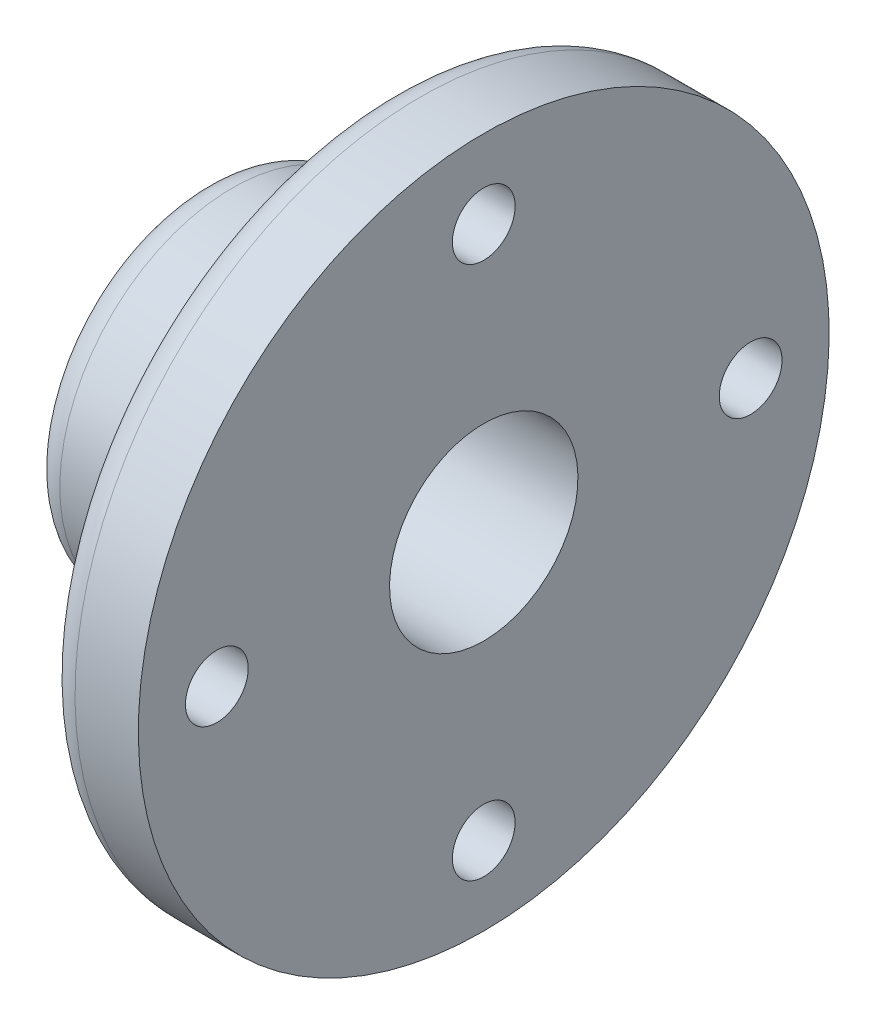
ISO-10303-21;
HEADER;
FILE_DESCRIPTION(('STEP AP214'),'2;1');
FILE_NAME('part.step','',(''),(''),'','','');
FILE_SCHEMA(('AUTOMOTIVE_DESIGN { 1 0 10303 214 1 1 1 1 }'));
ENDSEC;
DATA;
#1=APPLICATION_CONTEXT('core data for automotive mechanical design processes');
#2=APPLICATION_PROTOCOL_DEFINITION('international standard','automotive_design',2000,#1);
#3=PRODUCT_CONTEXT('',#1,'mechanical');
#4=PRODUCT('Part','Part','',(#3));
#5=PRODUCT_RELATED_PRODUCT_CATEGORY('part','',(#4));
#6=PRODUCT_DEFINITION_FORMATION('','',#4);
#7=PRODUCT_DEFINITION_CONTEXT('part definition',#1,'design');
#8=PRODUCT_DEFINITION('design','',#6,#7);
#9=PRODUCT_DEFINITION_SHAPE('','',#8);
#10=(LENGTH_UNIT() NAMED_UNIT(*) SI_UNIT(.MILLI.,.METRE.));
#11=(NAMED_UNIT(*) PLANE_ANGLE_UNIT() SI_UNIT($,.RADIAN.));
#12=(NAMED_UNIT(*) SI_UNIT($,.STERADIAN.) SOLID_ANGLE_UNIT());
#13=UNCERTAINTY_MEASURE_WITH_UNIT(LENGTH_MEASURE(1.E-05),#10,'distance_accuracy_value','');
#14=(GEOMETRIC_REPRESENTATION_CONTEXT(3) GLOBAL_UNCERTAINTY_ASSIGNED_CONTEXT((#13)) GLOBAL_UNIT_ASSIGNED_CONTEXT((#10,
#11,#12)) REPRESENTATION_CONTEXT('',''));
#15=CARTESIAN_POINT('',(0.,0.,0.));
#16=DIRECTION('',(0.,0.,1.));
#17=DIRECTION('',(1.,0.,0.));
#18=AXIS2_PLACEMENT_3D('',#15,#16,#17);
#19=CARTESIAN_POINT('',(0.,19.05,0.));
#20=DIRECTION('',(-1.,0.,0.));
#21=DIRECTION('',(0.,-1.,0.));
#22=AXIS2_PLACEMENT_3D('',#19,#20,#21);
#23=PLANE('',#22);
#24=CARTESIAN_POINT('',(0.,-1.88452705264058E-13,-53.975));
#25=DIRECTION('',(-1.,0.,0.));
#26=DIRECTION('',(0.,0.,1.));
#27=AXIS2_PLACEMENT_3D('',#24,#25,#26);
#28=CIRCLE('',#27,6.35);
#29=CARTESIAN_POINT('',(0.,-1.66281798762404E-13,-47.625));
#30=VERTEX_POINT('',#29);
#31=EDGE_CURVE('E83',#30,#30,#28,.T.);
#32=ORIENTED_EDGE('',*,*,#31,.T.);
#33=EDGE_LOOP('',(#32));
#34=FACE_BOUND('',#33,.T.);
#35=CARTESIAN_POINT('',(1.07552855510562E-13,-53.975,0.));
#36=DIRECTION('',(-1.,0.,0.));
#37=DIRECTION('',(0.,1.,0.));
#38=AXIS2_PLACEMENT_3D('',#35,#36,#37);
#39=CIRCLE('',#38,6.35);
#40=CARTESIAN_POINT('',(1.05612246527753E-13,-47.625,0.));
#41=VERTEX_POINT('',#40);
#42=EDGE_CURVE('E95',#41,#41,#39,.T.);
#43=ORIENTED_EDGE('',*,*,#42,.T.);
#44=EDGE_LOOP('',(#43));
#45=FACE_BOUND('',#44,.T.);
#46=CARTESIAN_POINT('',(0.,5.65358115792174E-13,53.975));
#47=DIRECTION('',(-1.,0.,0.));
#48=DIRECTION('',(0.,0.,-1.));
#49=AXIS2_PLACEMENT_3D('',#46,#47,#48);
#50=CIRCLE('',#49,6.35);
#51=CARTESIAN_POINT('',(0.,4.98845396287213E-13,47.625));
#52=VERTEX_POINT('',#51);
#53=EDGE_CURVE('E89',#52,#52,#50,.T.);
#54=ORIENTED_EDGE('',*,*,#53,.T.);
#55=EDGE_LOOP('',(#54));
#56=FACE_BOUND('',#55,.T.);
#57=CARTESIAN_POINT('',(0.,53.975,0.));
#58=DIRECTION('',(-1.,0.,0.));
#59=DIRECTION('',(0.,-1.,0.));
#60=AXIS2_PLACEMENT_3D('',#57,#58,#59);
#61=CIRCLE('',#60,6.35);
#62=CARTESIAN_POINT('',(0.,47.625,0.));
#63=VERTEX_POINT('',#62);
#64=EDGE_CURVE('E79',#63,#63,#61,.T.);
#65=ORIENTED_EDGE('',*,*,#64,.T.);
#66=EDGE_LOOP('',(#65));
#67=FACE_BOUND('',#66,.T.);
#68=CARTESIAN_POINT('',(0.,0.,0.));
#69=DIRECTION('',(-1.,0.,0.));
#70=DIRECTION('',(0.,-1.,0.));
#71=AXIS2_PLACEMENT_3D('',#68,#69,#70);
#72=CIRCLE('',#71,69.85);
#73=CARTESIAN_POINT('',(0.,-69.8499999999999,0.));
#74=VERTEX_POINT('',#73);
#75=EDGE_CURVE('E76',#74,#74,#72,.T.);
#76=ORIENTED_EDGE('',*,*,#75,.F.);
#77=EDGE_LOOP('',(#76));
#78=FACE_BOUND('',#77,.T.);
#79=CARTESIAN_POINT('',(0.,0.,0.));
#80=DIRECTION('',(-1.,0.,0.));
#81=DIRECTION('',(0.,-1.,0.));
#82=AXIS2_PLACEMENT_3D('',#79,#80,#81);
#83=CIRCLE('',#82,19.05);
#84=CARTESIAN_POINT('',(0.,-19.05,0.));
#85=VERTEX_POINT('',#84);
#86=EDGE_CURVE('E12',#85,#85,#83,.T.);
#87=ORIENTED_EDGE('',*,*,#86,.T.);
#88=EDGE_LOOP('',(#87));
#89=FACE_BOUND('',#88,.T.);
#90=ADVANCED_FACE('F42',(#34,#45,#56,#67,#78,#89),#23,.F.);
#91=CARTESIAN_POINT('',(-117.274050632911,0.,0.));
#92=DIRECTION('',(-1.,0.,0.));
#93=DIRECTION('',(0.,-1.,0.));
#94=AXIS2_PLACEMENT_3D('',#91,#92,#93);
#95=CYLINDRICAL_SURFACE('',#94,19.05);
#96=ORIENTED_EDGE('',*,*,#86,.F.);
#97=EDGE_LOOP('',(#96));
#98=FACE_BOUND('',#97,.T.);
#99=CARTESIAN_POINT('',(-55.118,0.,0.));
#100=DIRECTION('',(-1.,0.,0.));
#101=DIRECTION('',(0.,-1.,0.));
#102=AXIS2_PLACEMENT_3D('',#99,#100,#101);
#103=CIRCLE('',#102,19.05);
#104=CARTESIAN_POINT('',(-55.118,-19.05,0.));
#105=VERTEX_POINT('',#104);
#106=EDGE_CURVE('E48',#105,#105,#103,.T.);
#107=ORIENTED_EDGE('',*,*,#106,.T.);
#108=EDGE_LOOP('',(#107));
#109=FACE_BOUND('',#108,.T.);
#110=ADVANCED_FACE('F142',(#98,#109),#95,.F.);
#111=CARTESIAN_POINT('',(-57.15,0.,0.));
#112=DIRECTION('',(-1.,0.,0.));
#113=DIRECTION('',(0.,-1.,0.));
#114=AXIS2_PLACEMENT_3D('',#111,#112,#113);
#115=CONICAL_SURFACE('',#114,21.082,0.78539816339745);
#116=ORIENTED_EDGE('',*,*,#106,.F.);
#117=EDGE_LOOP('',(#116));
#118=FACE_BOUND('',#117,.T.);
#119=CARTESIAN_POINT('',(-57.15,0.,0.));
#120=DIRECTION('',(-1.,0.,0.));
#121=DIRECTION('',(0.,-1.,0.));
#122=AXIS2_PLACEMENT_3D('',#119,#120,#121);
#123=CIRCLE('',#122,21.082);
#124=CARTESIAN_POINT('',(-57.15,-21.082,0.));
#125=VERTEX_POINT('',#124);
#126=EDGE_CURVE('E52',#125,#125,#123,.T.);
#127=ORIENTED_EDGE('',*,*,#126,.T.);
#128=EDGE_LOOP('',(#127));
#129=FACE_BOUND('',#128,.T.);
#130=ADVANCED_FACE('F146',(#118,#129),#115,.F.);
#131=CARTESIAN_POINT('',(-57.15,28.575,0.));
#132=DIRECTION('',(1.,0.,0.));
#133=DIRECTION('',(0.,1.,0.));
#134=AXIS2_PLACEMENT_3D('',#131,#132,#133);
#135=PLANE('',#134);
#136=ORIENTED_EDGE('',*,*,#126,.F.);
#137=EDGE_LOOP('',(#136));
#138=FACE_BOUND('',#137,.T.);
#139=CARTESIAN_POINT('',(-57.15,0.,0.));
#140=DIRECTION('',(-1.,0.,0.));
#141=DIRECTION('',(0.,-1.,0.));
#142=AXIS2_PLACEMENT_3D('',#139,#140,#141);
#143=CIRCLE('',#142,28.575);
#144=CARTESIAN_POINT('',(-57.15,-28.5749999999999,0.));
#145=VERTEX_POINT('',#144);
#146=EDGE_CURVE('E56',#145,#145,#143,.T.);
#147=ORIENTED_EDGE('',*,*,#146,.T.);
#148=EDGE_LOOP('',(#147));
#149=FACE_BOUND('',#148,.T.);
#150=ADVANCED_FACE('F151',(#138,#149),#135,.F.);
#151=CARTESIAN_POINT('',(-50.8,0.,0.));
#152=DIRECTION('',(-1.,0.,0.));
#153=DIRECTION('',(0.,-1.,0.));
#154=AXIS2_PLACEMENT_3D('',#151,#152,#153);
#155=TOROIDAL_SURFACE('',#154,28.575,6.35);
#156=ORIENTED_EDGE('',*,*,#146,.F.);
#157=EDGE_LOOP('',(#156));
#158=FACE_BOUND('',#157,.T.);
#159=CARTESIAN_POINT('',(-50.7999999999999,0.,0.));
#160=DIRECTION('',(-1.,0.,0.));
#161=DIRECTION('',(0.,-1.,0.));
#162=AXIS2_PLACEMENT_3D('',#159,#160,#161);
#163=CIRCLE('',#162,34.925);
#164=CARTESIAN_POINT('',(-50.7999999999999,-34.925,0.));
#165=VERTEX_POINT('',#164);
#166=EDGE_CURVE('E61',#165,#165,#163,.T.);
#167=ORIENTED_EDGE('',*,*,#166,.T.);
#168=EDGE_LOOP('',(#167));
#169=FACE_BOUND('',#168,.T.);
#170=ADVANCED_FACE('F157',(#158,#169),#155,.T.);
#171=CARTESIAN_POINT('',(-117.274050632911,0.,0.));
#172=DIRECTION('',(-1.,0.,0.));
#173=DIRECTION('',(0.,-1.,0.));
#174=AXIS2_PLACEMENT_3D('',#171,#172,#173);
#175=CYLINDRICAL_SURFACE('',#174,34.925);
#176=ORIENTED_EDGE('',*,*,#166,.F.);
#177=EDGE_LOOP('',(#176));
#178=FACE_BOUND('',#177,.T.);
#179=CARTESIAN_POINT('',(-25.5016,0.,0.));
#180=DIRECTION('',(-1.,0.,0.));
#181=DIRECTION('',(0.,-1.,0.));
#182=AXIS2_PLACEMENT_3D('',#179,#180,#181);
#183=CIRCLE('',#182,34.925);
#184=CARTESIAN_POINT('',(-25.5016,-34.925,0.));
#185=VERTEX_POINT('',#184);
#186=EDGE_CURVE('E64',#185,#185,#183,.T.);
#187=ORIENTED_EDGE('',*,*,#186,.T.);
#188=EDGE_LOOP('',(#187));
#189=FACE_BOUND('',#188,.T.);
#190=ADVANCED_FACE('F161',(#178,#189),#175,.T.);
#191=CARTESIAN_POINT('',(-25.5016,0.,0.));
#192=DIRECTION('',(-1.,0.,0.));
#193=DIRECTION('',(0.,-1.,0.));
#194=AXIS2_PLACEMENT_3D('',#191,#192,#193);
#195=TOROIDAL_SURFACE('',#194,41.275,6.35);
#196=ORIENTED_EDGE('',*,*,#186,.F.);
#197=EDGE_LOOP('',(#196));
#198=FACE_BOUND('',#197,.T.);
#199=CARTESIAN_POINT('',(-19.1516,0.,0.));
#200=DIRECTION('',(-1.,0.,0.));
#201=DIRECTION('',(0.,-1.,0.));
#202=AXIS2_PLACEMENT_3D('',#199,#200,#201);
#203=CIRCLE('',#202,41.275);
#204=CARTESIAN_POINT('',(-19.1516,-41.275,0.));
#205=VERTEX_POINT('',#204);
#206=EDGE_CURVE('E67',#205,#205,#203,.T.);
#207=ORIENTED_EDGE('',*,*,#206,.T.);
#208=EDGE_LOOP('',(#207));
#209=FACE_BOUND('',#208,.T.);
#210=ADVANCED_FACE('F117',(#198,#209),#195,.F.);
#211=CARTESIAN_POINT('',(-19.1516,63.5,0.));
#212=DIRECTION('',(1.,0.,0.));
#213=DIRECTION('',(0.,1.,0.));
#214=AXIS2_PLACEMENT_3D('',#211,#212,#213);
#215=PLANE('',#214);
#216=CARTESIAN_POINT('',(-19.1516,-1.94305581956211E-13,-53.975));
#217=DIRECTION('',(-1.,0.,0.));
#218=DIRECTION('',(0.,0.,1.));
#219=AXIS2_PLACEMENT_3D('',#216,#217,#218);
#220=CIRCLE('',#219,6.35);
#221=CARTESIAN_POINT('',(-19.1516,-1.72134675454557E-13,-47.625));
#222=VERTEX_POINT('',#221);
#223=EDGE_CURVE('E98',#222,#222,#220,.T.);
#224=ORIENTED_EDGE('',*,*,#223,.F.);
#225=EDGE_LOOP('',(#224));
#226=FACE_BOUND('',#225,.T.);
#227=CARTESIAN_POINT('',(-19.1516,-53.975,0.));
#228=DIRECTION('',(-1.,0.,0.));
#229=DIRECTION('',(0.,1.,0.));
#230=AXIS2_PLACEMENT_3D('',#227,#228,#229);
#231=CIRCLE('',#230,6.35);
#232=CARTESIAN_POINT('',(-19.1516,-47.625,0.));
#233=VERTEX_POINT('',#232);
#234=EDGE_CURVE('E92',#233,#233,#231,.T.);
#235=ORIENTED_EDGE('',*,*,#234,.F.);
#236=EDGE_LOOP('',(#235));
#237=FACE_BOUND('',#236,.T.);
#238=CARTESIAN_POINT('',(-19.1516,5.59505239100021E-13,53.975));
#239=DIRECTION('',(-1.,0.,0.));
#240=DIRECTION('',(0.,0.,-1.));
#241=AXIS2_PLACEMENT_3D('',#238,#239,#240);
#242=CIRCLE('',#241,6.35);
#243=CARTESIAN_POINT('',(-19.1516,4.9299251959506E-13,47.625));
#244=VERTEX_POINT('',#243);
#245=EDGE_CURVE('E86',#244,#244,#242,.T.);
#246=ORIENTED_EDGE('',*,*,#245,.F.);
#247=EDGE_LOOP('',(#246));
#248=FACE_BOUND('',#247,.T.);
#249=CARTESIAN_POINT('',(-19.1516,53.975,0.));
#250=DIRECTION('',(-1.,0.,0.));
#251=DIRECTION('',(0.,-1.,0.));
#252=AXIS2_PLACEMENT_3D('',#249,#250,#251);
#253=CIRCLE('',#252,6.35);
#254=CARTESIAN_POINT('',(-19.1516,47.625,0.));
#255=VERTEX_POINT('',#254);
#256=EDGE_CURVE('E80',#255,#255,#253,.T.);
#257=ORIENTED_EDGE('',*,*,#256,.F.);
#258=EDGE_LOOP('',(#257));
#259=FACE_BOUND('',#258,.T.);
#260=ORIENTED_EDGE('',*,*,#206,.F.);
#261=EDGE_LOOP('',(#260));
#262=FACE_BOUND('',#261,.T.);
#263=CARTESIAN_POINT('',(-19.1516,0.,0.));
#264=DIRECTION('',(-1.,0.,0.));
#265=DIRECTION('',(0.,-1.,0.));
#266=AXIS2_PLACEMENT_3D('',#263,#264,#265);
#267=CIRCLE('',#266,63.4999999999999);
#268=CARTESIAN_POINT('',(-19.1516,-63.4999999999999,0.));
#269=VERTEX_POINT('',#268);
#270=EDGE_CURVE('E70',#269,#269,#267,.T.);
#271=ORIENTED_EDGE('',*,*,#270,.T.);
#272=EDGE_LOOP('',(#271));
#273=FACE_BOUND('',#272,.T.);
#274=ADVANCED_FACE('F113',(#226,#237,#248,#259,#262,#273),#215,.F.);
#275=CARTESIAN_POINT('',(-12.8016,0.,0.));
#276=DIRECTION('',(-1.,0.,0.));
#277=DIRECTION('',(0.,-1.,0.));
#278=AXIS2_PLACEMENT_3D('',#275,#276,#277);
#279=TOROIDAL_SURFACE('',#278,63.5,6.35);
#280=ORIENTED_EDGE('',*,*,#270,.F.);
#281=EDGE_LOOP('',(#280));
#282=FACE_BOUND('',#281,.T.);
#283=CARTESIAN_POINT('',(-12.8015999999999,0.,0.));
#284=DIRECTION('',(-1.,0.,0.));
#285=DIRECTION('',(0.,-1.,0.));
#286=AXIS2_PLACEMENT_3D('',#283,#284,#285);
#287=CIRCLE('',#286,69.85);
#288=CARTESIAN_POINT('',(-12.8015999999999,-69.85,0.));
#289=VERTEX_POINT('',#288);
#290=EDGE_CURVE('E73',#289,#289,#287,.T.);
#291=ORIENTED_EDGE('',*,*,#290,.T.);
#292=EDGE_LOOP('',(#291));
#293=FACE_BOUND('',#292,.T.);
#294=ADVANCED_FACE('F116',(#282,#293),#279,.T.);
#295=CARTESIAN_POINT('',(-117.274050632911,0.,0.));
#296=DIRECTION('',(-1.,0.,0.));
#297=DIRECTION('',(0.,-1.,0.));
#298=AXIS2_PLACEMENT_3D('',#295,#296,#297);
#299=CYLINDRICAL_SURFACE('',#298,69.85);
#300=ORIENTED_EDGE('',*,*,#290,.F.);
#301=EDGE_LOOP('',(#300));
#302=FACE_BOUND('',#301,.T.);
#303=ORIENTED_EDGE('',*,*,#75,.T.);
#304=EDGE_LOOP('',(#303));
#305=FACE_BOUND('',#304,.T.);
#306=ADVANCED_FACE('F131',(#302,#305),#299,.T.);
#307=CARTESIAN_POINT('',(0.,53.975,0.));
#308=DIRECTION('',(-1.,0.,0.));
#309=DIRECTION('',(0.,-1.,0.));
#310=AXIS2_PLACEMENT_3D('',#307,#308,#309);
#311=CYLINDRICAL_SURFACE('',#310,6.35);
#312=ORIENTED_EDGE('',*,*,#64,.F.);
#313=EDGE_LOOP('',(#312));
#314=FACE_BOUND('',#313,.T.);
#315=ORIENTED_EDGE('',*,*,#256,.T.);
#316=EDGE_LOOP('',(#315));
#317=FACE_BOUND('',#316,.T.);
#318=ADVANCED_FACE('F137',(#314,#317),#311,.F.);
#319=CARTESIAN_POINT('',(0.,5.65358115792174E-13,53.975));
#320=DIRECTION('',(-1.,0.,0.));
#321=DIRECTION('',(0.,-1.,0.));
#322=AXIS2_PLACEMENT_3D('',#319,#320,#321);
#323=CYLINDRICAL_SURFACE('',#322,6.35);
#324=ORIENTED_EDGE('',*,*,#53,.F.);
#325=EDGE_LOOP('',(#324));
#326=FACE_BOUND('',#325,.T.);
#327=ORIENTED_EDGE('',*,*,#245,.T.);
#328=EDGE_LOOP('',(#327));
#329=FACE_BOUND('',#328,.T.);
#330=ADVANCED_FACE('F171',(#326,#329),#323,.F.);
#331=CARTESIAN_POINT('',(1.07552855510562E-13,-53.975,0.));
#332=DIRECTION('',(-1.,0.,0.));
#333=DIRECTION('',(0.,-1.,0.));
#334=AXIS2_PLACEMENT_3D('',#331,#332,#333);
#335=CYLINDRICAL_SURFACE('',#334,6.35);
#336=ORIENTED_EDGE('',*,*,#42,.F.);
#337=EDGE_LOOP('',(#336));
#338=FACE_BOUND('',#337,.T.);
#339=ORIENTED_EDGE('',*,*,#234,.T.);
#340=EDGE_LOOP('',(#339));
#341=FACE_BOUND('',#340,.T.);
#342=ADVANCED_FACE('F109',(#338,#341),#335,.F.);
#343=CARTESIAN_POINT('',(0.,-1.88452705264058E-13,-53.975));
#344=DIRECTION('',(-1.,0.,0.));
#345=DIRECTION('',(0.,-1.,0.));
#346=AXIS2_PLACEMENT_3D('',#343,#344,#345);
#347=CYLINDRICAL_SURFACE('',#346,6.35);
#348=ORIENTED_EDGE('',*,*,#31,.F.);
#349=EDGE_LOOP('',(#348));
#350=FACE_BOUND('',#349,.T.);
#351=ORIENTED_EDGE('',*,*,#223,.T.);
#352=EDGE_LOOP('',(#351));
#353=FACE_BOUND('',#352,.T.);
#354=ADVANCED_FACE('F106',(#350,#353),#347,.F.);
#355=CLOSED_SHELL('',(#90,#110,#130,#150,#170,#190,#210,#274,#294,#306,#318,#330,#342,#354));
#356=MANIFOLD_SOLID_BREP('B2',#355);
#357=ADVANCED_BREP_SHAPE_REPRESENTATION('',(#18,#356),#14);
#358=SHAPE_DEFINITION_REPRESENTATION(#9,#357);
ENDSEC;
END-ISO-10303-21;
